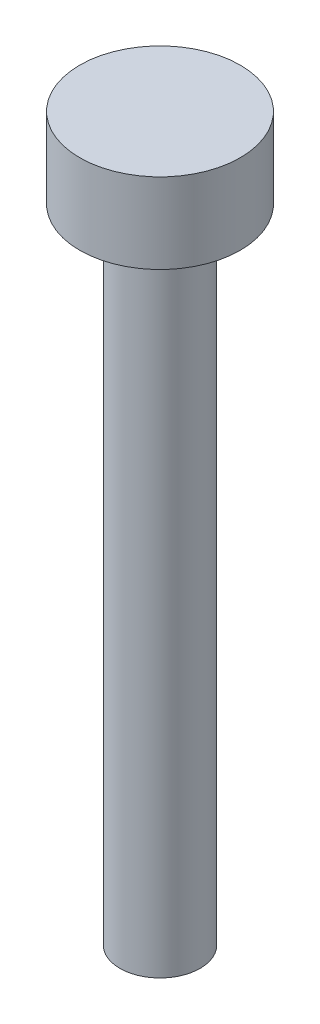
ISO-10303-21;
HEADER;
FILE_DESCRIPTION(('STEP AP214'),'2;1');
FILE_NAME('part.step','',(''),(''),'','','');
FILE_SCHEMA(('AUTOMOTIVE_DESIGN { 1 0 10303 214 1 1 1 1 }'));
ENDSEC;
DATA;
#1=APPLICATION_CONTEXT('core data for automotive mechanical design processes');
#2=APPLICATION_PROTOCOL_DEFINITION('international standard','automotive_design',2000,#1);
#3=PRODUCT_CONTEXT('',#1,'mechanical');
#4=PRODUCT('Part','Part','',(#3));
#5=PRODUCT_RELATED_PRODUCT_CATEGORY('part','',(#4));
#6=PRODUCT_DEFINITION_FORMATION('','',#4);
#7=PRODUCT_DEFINITION_CONTEXT('part definition',#1,'design');
#8=PRODUCT_DEFINITION('design','',#6,#7);
#9=PRODUCT_DEFINITION_SHAPE('','',#8);
#10=(LENGTH_UNIT() NAMED_UNIT(*) SI_UNIT(.MILLI.,.METRE.));
#11=(NAMED_UNIT(*) PLANE_ANGLE_UNIT() SI_UNIT($,.RADIAN.));
#12=(NAMED_UNIT(*) SI_UNIT($,.STERADIAN.) SOLID_ANGLE_UNIT());
#13=UNCERTAINTY_MEASURE_WITH_UNIT(LENGTH_MEASURE(1.E-05),#10,'distance_accuracy_value','');
#14=(GEOMETRIC_REPRESENTATION_CONTEXT(3) GLOBAL_UNCERTAINTY_ASSIGNED_CONTEXT((#13)) GLOBAL_UNIT_ASSIGNED_CONTEXT((#10,
#11,#12)) REPRESENTATION_CONTEXT('',''));
#15=CARTESIAN_POINT('',(0.,0.,0.));
#16=DIRECTION('',(0.,0.,1.));
#17=DIRECTION('',(1.,0.,0.));
#18=AXIS2_PLACEMENT_3D('',#15,#16,#17);
#19=CARTESIAN_POINT('',(0.,50.8,0.));
#20=DIRECTION('',(0.,-1.,0.));
#21=DIRECTION('',(0.,0.,-1.));
#22=AXIS2_PLACEMENT_3D('',#19,#20,#21);
#23=CYLINDRICAL_SURFACE('',#22,3.175);
#24=CARTESIAN_POINT('',(0.,50.8,0.));
#25=DIRECTION('',(0.,1.,0.));
#26=DIRECTION('',(0.,0.,1.));
#27=AXIS2_PLACEMENT_3D('',#24,#25,#26);
#28=CIRCLE('',#27,3.175);
#29=CARTESIAN_POINT('',(0.,50.8,3.175));
#30=VERTEX_POINT('',#29);
#31=EDGE_CURVE('E10',#30,#30,#28,.T.);
#32=ORIENTED_EDGE('',*,*,#31,.F.);
#33=EDGE_LOOP('',(#32));
#34=FACE_BOUND('',#33,.T.);
#35=CARTESIAN_POINT('',(0.,0.,0.));
#36=DIRECTION('',(0.,1.,0.));
#37=DIRECTION('',(0.,0.,1.));
#38=AXIS2_PLACEMENT_3D('',#35,#36,#37);
#39=CIRCLE('',#38,3.175);
#40=CARTESIAN_POINT('',(0.,0.,3.175));
#41=VERTEX_POINT('',#40);
#42=EDGE_CURVE('E34',#41,#41,#39,.T.);
#43=ORIENTED_EDGE('',*,*,#42,.T.);
#44=EDGE_LOOP('',(#43));
#45=FACE_BOUND('',#44,.T.);
#46=ADVANCED_FACE('F31',(#34,#45),#23,.T.);
#47=CARTESIAN_POINT('',(0.,0.,0.));
#48=DIRECTION('',(0.,1.,0.));
#49=DIRECTION('',(0.,0.,1.));
#50=AXIS2_PLACEMENT_3D('',#47,#48,#49);
#51=PLANE('',#50);
#52=ORIENTED_EDGE('',*,*,#42,.F.);
#53=EDGE_LOOP('',(#52));
#54=FACE_BOUND('',#53,.T.);
#55=ADVANCED_FACE('F54',(#54),#51,.F.);
#56=CARTESIAN_POINT('',(0.,57.15,0.));
#57=DIRECTION('',(0.,-1.,0.));
#58=DIRECTION('',(0.,0.,-1.));
#59=AXIS2_PLACEMENT_3D('',#56,#57,#58);
#60=CYLINDRICAL_SURFACE('',#59,6.35);
#61=CARTESIAN_POINT('',(0.,57.15,0.));
#62=DIRECTION('',(0.,1.,0.));
#63=DIRECTION('',(0.,0.,1.));
#64=AXIS2_PLACEMENT_3D('',#61,#62,#63);
#65=CIRCLE('',#64,6.35);
#66=CARTESIAN_POINT('',(0.,57.15,6.35));
#67=VERTEX_POINT('',#66);
#68=EDGE_CURVE('E41',#67,#67,#65,.T.);
#69=ORIENTED_EDGE('',*,*,#68,.F.);
#70=EDGE_LOOP('',(#69));
#71=FACE_BOUND('',#70,.T.);
#72=CARTESIAN_POINT('',(0.,50.8,0.));
#73=DIRECTION('',(0.,1.,0.));
#74=DIRECTION('',(0.,0.,1.));
#75=AXIS2_PLACEMENT_3D('',#72,#73,#74);
#76=CIRCLE('',#75,6.35);
#77=CARTESIAN_POINT('',(0.,50.8,6.35));
#78=VERTEX_POINT('',#77);
#79=EDGE_CURVE('E43',#78,#78,#76,.T.);
#80=ORIENTED_EDGE('',*,*,#79,.T.);
#81=EDGE_LOOP('',(#80));
#82=FACE_BOUND('',#81,.T.);
#83=ADVANCED_FACE('F51',(#71,#82),#60,.T.);
#84=CARTESIAN_POINT('',(0.,57.15,0.));
#85=DIRECTION('',(0.,1.,0.));
#86=DIRECTION('',(0.,0.,1.));
#87=AXIS2_PLACEMENT_3D('',#84,#85,#86);
#88=PLANE('',#87);
#89=ORIENTED_EDGE('',*,*,#68,.T.);
#90=EDGE_LOOP('',(#89));
#91=FACE_BOUND('',#90,.T.);
#92=ADVANCED_FACE('F49',(#91),#88,.T.);
#93=CARTESIAN_POINT('',(0.,50.8,0.));
#94=DIRECTION('',(0.,1.,0.));
#95=DIRECTION('',(0.,0.,1.));
#96=AXIS2_PLACEMENT_3D('',#93,#94,#95);
#97=PLANE('',#96);
#98=ORIENTED_EDGE('',*,*,#31,.T.);
#99=EDGE_LOOP('',(#98));
#100=FACE_BOUND('',#99,.T.);
#101=ORIENTED_EDGE('',*,*,#79,.F.);
#102=EDGE_LOOP('',(#101));
#103=FACE_BOUND('',#102,.T.);
#104=ADVANCED_FACE('F58',(#100,#103),#97,.F.);
#105=CLOSED_SHELL('',(#46,#55,#83,#92,#104));
#106=MANIFOLD_SOLID_BREP('B2',#105);
#107=ADVANCED_BREP_SHAPE_REPRESENTATION('',(#18,#106),#14);
#108=SHAPE_DEFINITION_REPRESENTATION(#9,#107);
ENDSEC;
END-ISO-10303-21;
